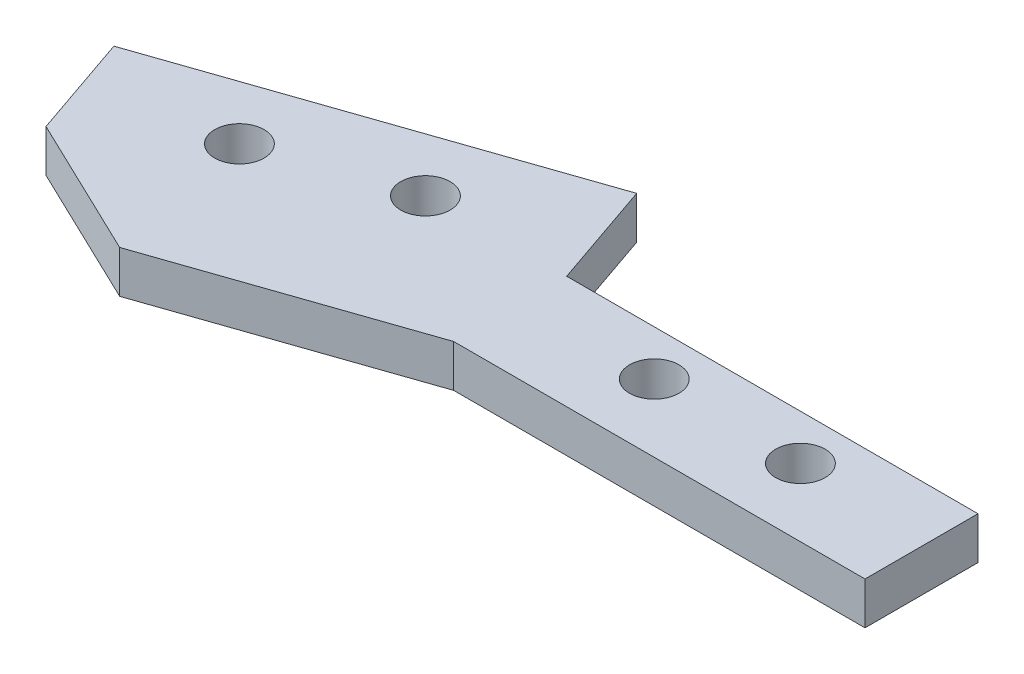
ISO-10303-21;
HEADER;
FILE_DESCRIPTION(('STEP AP214'),'2;1');
FILE_NAME('part.step','',(''),(''),'','','');
FILE_SCHEMA(('AUTOMOTIVE_DESIGN { 1 0 10303 214 1 1 1 1 }'));
ENDSEC;
DATA;
#1=APPLICATION_CONTEXT('core data for automotive mechanical design processes');
#2=APPLICATION_PROTOCOL_DEFINITION('international standard','automotive_design',2000,#1);
#3=PRODUCT_CONTEXT('',#1,'mechanical');
#4=PRODUCT('Part','Part','',(#3));
#5=PRODUCT_RELATED_PRODUCT_CATEGORY('part','',(#4));
#6=PRODUCT_DEFINITION_FORMATION('','',#4);
#7=PRODUCT_DEFINITION_CONTEXT('part definition',#1,'design');
#8=PRODUCT_DEFINITION('design','',#6,#7);
#9=PRODUCT_DEFINITION_SHAPE('','',#8);
#10=(LENGTH_UNIT() NAMED_UNIT(*) SI_UNIT(.MILLI.,.METRE.));
#11=(NAMED_UNIT(*) PLANE_ANGLE_UNIT() SI_UNIT($,.RADIAN.));
#12=(NAMED_UNIT(*) SI_UNIT($,.STERADIAN.) SOLID_ANGLE_UNIT());
#13=UNCERTAINTY_MEASURE_WITH_UNIT(LENGTH_MEASURE(1.E-05),#10,'distance_accuracy_value','');
#14=(GEOMETRIC_REPRESENTATION_CONTEXT(3) GLOBAL_UNCERTAINTY_ASSIGNED_CONTEXT((#13)) GLOBAL_UNIT_ASSIGNED_CONTEXT((#10,
#11,#12)) REPRESENTATION_CONTEXT('',''));
#15=CARTESIAN_POINT('',(0.,0.,0.));
#16=DIRECTION('',(0.,0.,1.));
#17=DIRECTION('',(1.,0.,0.));
#18=AXIS2_PLACEMENT_3D('',#15,#16,#17);
#19=CARTESIAN_POINT('',(-11.6856515049961,3.,-33.9375962135392));
#20=DIRECTION('',(0.325568154457151,0.,0.945518575599319));
#21=DIRECTION('',(0.945518575599319,0.,-0.325568154457151));
#22=AXIS2_PLACEMENT_3D('',#19,#20,#21);
#23=PLANE('',#22);
#24=DIRECTION('',(0.,-1.,0.));
#25=VECTOR('',#24,1.);
#26=CARTESIAN_POINT('',(-67.822315900336,10.,-14.6081925442493));
#27=LINE('',#26,#25);
#28=CARTESIAN_POINT('',(-67.822315900336,3.,-14.6081925442493));
#29=VERTEX_POINT('',#28);
#30=CARTESIAN_POINT('',(-67.822315900336,0.,-14.6081925442493));
#31=VERTEX_POINT('',#30);
#32=EDGE_CURVE('E123',#29,#31,#27,.T.);
#33=ORIENTED_EDGE('',*,*,#32,.T.);
#34=DIRECTION('',(-0.945518575599319,0.,0.325568154457151));
#35=VECTOR('',#34,1.);
#36=CARTESIAN_POINT('',(-11.6856515049961,0.,-33.9375962135392));
#37=LINE('',#36,#35);
#38=CARTESIAN_POINT('',(-50.2257439693409,0.,-20.6671781593286));
#39=VERTEX_POINT('',#38);
#40=EDGE_CURVE('E122',#39,#31,#37,.T.);
#41=ORIENTED_EDGE('',*,*,#40,.F.);
#42=DIRECTION('',(0.,-1.,0.));
#43=VECTOR('',#42,1.);
#44=CARTESIAN_POINT('',(-50.2257439693409,3.,-20.6671781593286));
#45=LINE('',#44,#43);
#46=CARTESIAN_POINT('',(-50.2257439693409,3.,-20.6671781593286));
#47=VERTEX_POINT('',#46);
#48=EDGE_CURVE('E11',#47,#39,#45,.T.);
#49=ORIENTED_EDGE('',*,*,#48,.F.);
#50=DIRECTION('',(-0.945518575599319,0.,0.325568154457151));
#51=VECTOR('',#50,1.);
#52=CARTESIAN_POINT('',(-11.6856515049961,3.,-33.9375962135392));
#53=LINE('',#52,#51);
#54=EDGE_CURVE('E147',#47,#29,#53,.T.);
#55=ORIENTED_EDGE('',*,*,#54,.T.);
#56=EDGE_LOOP('',(#33,#41,#49,#55));
#57=FACE_BOUND('',#56,.T.);
#58=ADVANCED_FACE('F34',(#57),#23,.T.);
#59=CARTESIAN_POINT('',(0.,3.,0.));
#60=DIRECTION('',(0.,1.,0.));
#61=DIRECTION('',(0.,0.,1.));
#62=AXIS2_PLACEMENT_3D('',#59,#60,#61);
#63=PLANE('',#62);
#64=DIRECTION('',(-0.901649680844333,0.,-0.432467169890748));
#65=VECTOR('',#64,1.);
#66=CARTESIAN_POINT('',(-6.98843284864242,3.,14.5701655207083));
#67=LINE('',#66,#65);
#68=CARTESIAN_POINT('',(-77.8479852024577,3.,-19.4169036450938));
#69=VERTEX_POINT('',#68);
#70=EDGE_CURVE('E50',#29,#69,#67,.T.);
#71=ORIENTED_EDGE('',*,*,#70,.F.);
#72=ORIENTED_EDGE('',*,*,#54,.F.);
#73=DIRECTION('',(1.,0.,0.));
#74=VECTOR('',#73,1.);
#75=CARTESIAN_POINT('',(0.,3.,-20.6671781593286));
#76=LINE('',#75,#74);
#77=CARTESIAN_POINT('',(-21.0955516893409,3.,-20.6671781593286));
#78=VERTEX_POINT('',#77);
#79=EDGE_CURVE('E149',#47,#78,#76,.T.);
#80=ORIENTED_EDGE('',*,*,#79,.T.);
#81=DIRECTION('',(0.,0.,1.));
#82=VECTOR('',#81,1.);
#83=CARTESIAN_POINT('',(-21.0955516893409,3.,0.));
#84=LINE('',#83,#82);
#85=CARTESIAN_POINT('',(-21.0955516893409,3.,-28.6704432593286));
#86=VERTEX_POINT('',#85);
#87=EDGE_CURVE('E151',#86,#78,#84,.T.);
#88=ORIENTED_EDGE('',*,*,#87,.F.);
#89=DIRECTION('',(1.,0.,0.));
#90=VECTOR('',#89,1.);
#91=CARTESIAN_POINT('',(0.,3.,-28.6704432593286));
#92=LINE('',#91,#90);
#93=CARTESIAN_POINT('',(-50.2257439693409,3.,-28.6704432593286));
#94=VERTEX_POINT('',#93);
#95=EDGE_CURVE('E154',#94,#86,#92,.T.);
#96=ORIENTED_EDGE('',*,*,#95,.F.);
#97=DIRECTION('',(0.325568154457154,0.,0.945518575599318));
#98=VECTOR('',#97,1.);
#99=CARTESIAN_POINT('',(-52.8302892049981,3.,-36.2345918641231));
#100=LINE('',#99,#98);
#101=CARTESIAN_POINT('',(-52.8302892049981,3.,-36.2345918641231));
#102=VERTEX_POINT('',#101);
#103=EDGE_CURVE('E132',#102,#94,#100,.T.);
#104=ORIENTED_EDGE('',*,*,#103,.F.);
#105=DIRECTION('',(0.945518575599318,0.,-0.325568154457154));
#106=VECTOR('',#105,1.);
#107=CARTESIAN_POINT('',(-52.8302892049981,3.,-36.2345918641231));
#108=LINE('',#107,#106);
#109=CARTESIAN_POINT('',(-80.3732453122062,3.,-26.7507915247862));
#110=VERTEX_POINT('',#109);
#111=EDGE_CURVE('E187',#110,#102,#108,.T.);
#112=ORIENTED_EDGE('',*,*,#111,.F.);
#113=DIRECTION('',(0.325568154457154,0.,0.945518575599318));
#114=VECTOR('',#113,1.);
#115=CARTESIAN_POINT('',(-80.3732453122062,3.,-26.7507915247862));
#116=LINE('',#115,#114);
#117=EDGE_CURVE('E128',#110,#69,#116,.T.);
#118=ORIENTED_EDGE('',*,*,#117,.T.);
#119=EDGE_LOOP('',(#71,#72,#80,#88,#96,#104,#112,#118));
#120=FACE_BOUND('',#119,.T.);
#121=CARTESIAN_POINT('',(-60.1598159333281,3.,-28.6007019462031));
#122=DIRECTION('',(0.,1.,0.));
#123=DIRECTION('',(0.,0.,1.));
#124=AXIS2_PLACEMENT_3D('',#121,#122,#123);
#125=CIRCLE('',#124,1.75000000000001);
#126=CARTESIAN_POINT('',(-60.1598159333281,3.,-26.8507019462031));
#127=VERTEX_POINT('',#126);
#128=EDGE_CURVE('E199',#127,#127,#125,.T.);
#129=ORIENTED_EDGE('',*,*,#128,.F.);
#130=EDGE_LOOP('',(#129));
#131=FACE_BOUND('',#130,.T.);
#132=CARTESIAN_POINT('',(-69.9356556828962,3.,-25.2013700885784));
#133=DIRECTION('',(0.,1.,0.));
#134=DIRECTION('',(0.,0.,1.));
#135=AXIS2_PLACEMENT_3D('',#132,#133,#134);
#136=CIRCLE('',#135,1.74999999999998);
#137=CARTESIAN_POINT('',(-69.9356556828962,3.,-23.4513700885784));
#138=VERTEX_POINT('',#137);
#139=EDGE_CURVE('E193',#138,#138,#136,.T.);
#140=ORIENTED_EDGE('',*,*,#139,.F.);
#141=EDGE_LOOP('',(#140));
#142=FACE_BOUND('',#141,.T.);
#143=CARTESIAN_POINT('',(-40.8205516893409,3.,-25.4671781460562));
#144=DIRECTION('',(0.,-1.,0.));
#145=DIRECTION('',(0.,0.,-1.));
#146=AXIS2_PLACEMENT_3D('',#143,#144,#145);
#147=CIRCLE('',#146,1.75);
#148=CARTESIAN_POINT('',(-40.8205516893409,3.,-27.2171781460562));
#149=VERTEX_POINT('',#148);
#150=EDGE_CURVE('E136',#149,#149,#147,.T.);
#151=ORIENTED_EDGE('',*,*,#150,.T.);
#152=EDGE_LOOP('',(#151));
#153=FACE_BOUND('',#152,.T.);
#154=CARTESIAN_POINT('',(-30.4705516893409,3.,-25.4671781460562));
#155=DIRECTION('',(0.,-1.,0.));
#156=DIRECTION('',(0.,0.,-1.));
#157=AXIS2_PLACEMENT_3D('',#154,#155,#156);
#158=CIRCLE('',#157,1.75);
#159=CARTESIAN_POINT('',(-30.4705516893409,3.,-27.2171781460562));
#160=VERTEX_POINT('',#159);
#161=EDGE_CURVE('E142',#160,#160,#158,.T.);
#162=ORIENTED_EDGE('',*,*,#161,.T.);
#163=EDGE_LOOP('',(#162));
#164=FACE_BOUND('',#163,.T.);
#165=ADVANCED_FACE('F208',(#120,#131,#142,#153,#164),#63,.T.);
#166=CARTESIAN_POINT('',(0.,0.,0.));
#167=DIRECTION('',(0.,1.,0.));
#168=DIRECTION('',(0.,0.,1.));
#169=AXIS2_PLACEMENT_3D('',#166,#167,#168);
#170=PLANE('',#169);
#171=CARTESIAN_POINT('',(-30.4705516893409,0.,-25.4671781460562));
#172=DIRECTION('',(0.,-1.,0.));
#173=DIRECTION('',(0.,0.,-1.));
#174=AXIS2_PLACEMENT_3D('',#171,#172,#173);
#175=CIRCLE('',#174,1.75);
#176=CARTESIAN_POINT('',(-30.4705516893409,0.,-27.2171781460562));
#177=VERTEX_POINT('',#176);
#178=EDGE_CURVE('E139',#177,#177,#175,.T.);
#179=ORIENTED_EDGE('',*,*,#178,.F.);
#180=EDGE_LOOP('',(#179));
#181=FACE_BOUND('',#180,.T.);
#182=CARTESIAN_POINT('',(-40.8205516893409,0.,-25.4671781460562));
#183=DIRECTION('',(0.,-1.,0.));
#184=DIRECTION('',(0.,0.,-1.));
#185=AXIS2_PLACEMENT_3D('',#182,#183,#184);
#186=CIRCLE('',#185,1.75);
#187=CARTESIAN_POINT('',(-40.8205516893409,0.,-27.2171781460562));
#188=VERTEX_POINT('',#187);
#189=EDGE_CURVE('E130',#188,#188,#186,.T.);
#190=ORIENTED_EDGE('',*,*,#189,.F.);
#191=EDGE_LOOP('',(#190));
#192=FACE_BOUND('',#191,.T.);
#193=CARTESIAN_POINT('',(-69.9356556828962,0.,-25.2013700885784));
#194=DIRECTION('',(0.,-1.,0.));
#195=DIRECTION('',(0.,0.,-1.));
#196=AXIS2_PLACEMENT_3D('',#193,#194,#195);
#197=CIRCLE('',#196,1.74999999999998);
#198=CARTESIAN_POINT('',(-69.9356556828962,0.,-26.9513700885784));
#199=VERTEX_POINT('',#198);
#200=EDGE_CURVE('E196',#199,#199,#197,.T.);
#201=ORIENTED_EDGE('',*,*,#200,.F.);
#202=EDGE_LOOP('',(#201));
#203=FACE_BOUND('',#202,.T.);
#204=CARTESIAN_POINT('',(-60.1598159333281,0.,-28.6007019462031));
#205=DIRECTION('',(0.,-1.,0.));
#206=DIRECTION('',(0.,0.,-1.));
#207=AXIS2_PLACEMENT_3D('',#204,#205,#206);
#208=CIRCLE('',#207,1.75000000000001);
#209=CARTESIAN_POINT('',(-60.1598159333281,0.,-30.3507019462032));
#210=VERTEX_POINT('',#209);
#211=EDGE_CURVE('E113',#210,#210,#208,.T.);
#212=ORIENTED_EDGE('',*,*,#211,.F.);
#213=EDGE_LOOP('',(#212));
#214=FACE_BOUND('',#213,.T.);
#215=ORIENTED_EDGE('',*,*,#40,.T.);
#216=DIRECTION('',(0.901649680844333,0.,0.432467169890748));
#217=VECTOR('',#216,1.);
#218=CARTESIAN_POINT('',(-6.98843284864242,0.,14.5701655207083));
#219=LINE('',#218,#217);
#220=CARTESIAN_POINT('',(-77.8479852024577,0.,-19.4169036450938));
#221=VERTEX_POINT('',#220);
#222=EDGE_CURVE('E107',#221,#31,#219,.T.);
#223=ORIENTED_EDGE('',*,*,#222,.F.);
#224=DIRECTION('',(0.325568154457154,0.,0.945518575599318));
#225=VECTOR('',#224,1.);
#226=CARTESIAN_POINT('',(-80.3732453122062,0.,-26.7507915247862));
#227=LINE('',#226,#225);
#228=CARTESIAN_POINT('',(-80.3732453122062,0.,-26.7507915247862));
#229=VERTEX_POINT('',#228);
#230=EDGE_CURVE('E119',#229,#221,#227,.T.);
#231=ORIENTED_EDGE('',*,*,#230,.F.);
#232=DIRECTION('',(-0.945518575599318,0.,0.325568154457154));
#233=VECTOR('',#232,1.);
#234=CARTESIAN_POINT('',(-52.8302892049981,0.,-36.2345918641231));
#235=LINE('',#234,#233);
#236=CARTESIAN_POINT('',(-52.8302892049981,0.,-36.2345918641231));
#237=VERTEX_POINT('',#236);
#238=EDGE_CURVE('E177',#237,#229,#235,.T.);
#239=ORIENTED_EDGE('',*,*,#238,.F.);
#240=DIRECTION('',(0.325568154457154,0.,0.945518575599318));
#241=VECTOR('',#240,1.);
#242=CARTESIAN_POINT('',(-52.8302892049981,0.,-36.2345918641231));
#243=LINE('',#242,#241);
#244=CARTESIAN_POINT('',(-50.2257439693409,0.,-28.6704432593286));
#245=VERTEX_POINT('',#244);
#246=EDGE_CURVE('E127',#237,#245,#243,.T.);
#247=ORIENTED_EDGE('',*,*,#246,.T.);
#248=DIRECTION('',(1.,0.,0.));
#249=VECTOR('',#248,1.);
#250=CARTESIAN_POINT('',(0.,0.,-28.6704432593286));
#251=LINE('',#250,#249);
#252=CARTESIAN_POINT('',(-21.0955516893409,0.,-28.6704432593286));
#253=VERTEX_POINT('',#252);
#254=EDGE_CURVE('E77',#245,#253,#251,.T.);
#255=ORIENTED_EDGE('',*,*,#254,.T.);
#256=DIRECTION('',(0.,0.,1.));
#257=VECTOR('',#256,1.);
#258=CARTESIAN_POINT('',(-21.0955516893409,0.,0.));
#259=LINE('',#258,#257);
#260=CARTESIAN_POINT('',(-21.0955516893409,0.,-20.6671781593286));
#261=VERTEX_POINT('',#260);
#262=EDGE_CURVE('E160',#253,#261,#259,.T.);
#263=ORIENTED_EDGE('',*,*,#262,.T.);
#264=DIRECTION('',(1.,0.,0.));
#265=VECTOR('',#264,1.);
#266=CARTESIAN_POINT('',(0.,0.,-20.6671781593286));
#267=LINE('',#266,#265);
#268=EDGE_CURVE('E157',#39,#261,#267,.T.);
#269=ORIENTED_EDGE('',*,*,#268,.F.);
#270=EDGE_LOOP('',(#215,#223,#231,#239,#247,#255,#263,#269));
#271=FACE_BOUND('',#270,.T.);
#272=ADVANCED_FACE('F118',(#181,#192,#203,#214,#271),#170,.F.);
#273=CARTESIAN_POINT('',(-80.3732453122062,3.,-26.7507915247862));
#274=DIRECTION('',(0.945518575599318,0.,-0.325568154457154));
#275=DIRECTION('',(-0.325568154457154,0.,-0.945518575599318));
#276=AXIS2_PLACEMENT_3D('',#273,#274,#275);
#277=PLANE('',#276);
#278=DIRECTION('',(0.,-1.,0.));
#279=VECTOR('',#278,1.);
#280=CARTESIAN_POINT('',(-77.8479852024577,3.,-19.4169036450938));
#281=LINE('',#280,#279);
#282=EDGE_CURVE('E104',#69,#221,#281,.T.);
#283=ORIENTED_EDGE('',*,*,#282,.F.);
#284=ORIENTED_EDGE('',*,*,#117,.F.);
#285=DIRECTION('',(0.,1.,0.));
#286=VECTOR('',#285,1.);
#287=CARTESIAN_POINT('',(-80.3732453122062,3.,-26.7507915247862));
#288=LINE('',#287,#286);
#289=EDGE_CURVE('E126',#229,#110,#288,.T.);
#290=ORIENTED_EDGE('',*,*,#289,.F.);
#291=ORIENTED_EDGE('',*,*,#230,.T.);
#292=EDGE_LOOP('',(#283,#284,#290,#291));
#293=FACE_BOUND('',#292,.T.);
#294=ADVANCED_FACE('F125',(#293),#277,.F.);
#295=CARTESIAN_POINT('',(0.,3.,-20.6671781593286));
#296=DIRECTION('',(0.,0.,-1.));
#297=DIRECTION('',(-1.,0.,0.));
#298=AXIS2_PLACEMENT_3D('',#295,#296,#297);
#299=PLANE('',#298);
#300=ORIENTED_EDGE('',*,*,#268,.T.);
#301=DIRECTION('',(0.,-1.,0.));
#302=VECTOR('',#301,1.);
#303=CARTESIAN_POINT('',(-21.0955516893409,3.,-20.6671781593286));
#304=LINE('',#303,#302);
#305=EDGE_CURVE('E42',#78,#261,#304,.T.);
#306=ORIENTED_EDGE('',*,*,#305,.F.);
#307=ORIENTED_EDGE('',*,*,#79,.F.);
#308=ORIENTED_EDGE('',*,*,#48,.T.);
#309=EDGE_LOOP('',(#300,#306,#307,#308));
#310=FACE_BOUND('',#309,.T.);
#311=ADVANCED_FACE('F175',(#310),#299,.F.);
#312=CARTESIAN_POINT('',(-21.0955516893409,3.,0.));
#313=DIRECTION('',(1.,0.,0.));
#314=DIRECTION('',(0.,0.,-1.));
#315=AXIS2_PLACEMENT_3D('',#312,#313,#314);
#316=PLANE('',#315);
#317=ORIENTED_EDGE('',*,*,#262,.F.);
#318=DIRECTION('',(0.,-1.,0.));
#319=VECTOR('',#318,1.);
#320=CARTESIAN_POINT('',(-21.0955516893409,3.,-28.6704432593286));
#321=LINE('',#320,#319);
#322=EDGE_CURVE('E165',#86,#253,#321,.T.);
#323=ORIENTED_EDGE('',*,*,#322,.F.);
#324=ORIENTED_EDGE('',*,*,#87,.T.);
#325=ORIENTED_EDGE('',*,*,#305,.T.);
#326=EDGE_LOOP('',(#317,#323,#324,#325));
#327=FACE_BOUND('',#326,.T.);
#328=ADVANCED_FACE('F172',(#327),#316,.T.);
#329=CARTESIAN_POINT('',(0.,3.,-28.6704432593286));
#330=DIRECTION('',(0.,0.,-1.));
#331=DIRECTION('',(-1.,0.,0.));
#332=AXIS2_PLACEMENT_3D('',#329,#330,#331);
#333=PLANE('',#332);
#334=ORIENTED_EDGE('',*,*,#254,.F.);
#335=DIRECTION('',(0.,-1.,0.));
#336=VECTOR('',#335,1.);
#337=CARTESIAN_POINT('',(-50.2257439693409,3.,-28.6704432593286));
#338=LINE('',#337,#336);
#339=EDGE_CURVE('E59',#94,#245,#338,.T.);
#340=ORIENTED_EDGE('',*,*,#339,.F.);
#341=ORIENTED_EDGE('',*,*,#95,.T.);
#342=ORIENTED_EDGE('',*,*,#322,.T.);
#343=EDGE_LOOP('',(#334,#340,#341,#342));
#344=FACE_BOUND('',#343,.T.);
#345=ADVANCED_FACE('F210',(#344),#333,.T.);
#346=CARTESIAN_POINT('',(-30.4705516893409,3.,-25.4671781460562));
#347=DIRECTION('',(0.,-1.,0.));
#348=DIRECTION('',(0.,0.,-1.));
#349=AXIS2_PLACEMENT_3D('',#346,#347,#348);
#350=CYLINDRICAL_SURFACE('',#349,1.75);
#351=ORIENTED_EDGE('',*,*,#161,.F.);
#352=EDGE_LOOP('',(#351));
#353=FACE_BOUND('',#352,.T.);
#354=ORIENTED_EDGE('',*,*,#178,.T.);
#355=EDGE_LOOP('',(#354));
#356=FACE_BOUND('',#355,.T.);
#357=ADVANCED_FACE('F212',(#353,#356),#350,.F.);
#358=CARTESIAN_POINT('',(-40.8205516893409,3.,-25.4671781460562));
#359=DIRECTION('',(0.,-1.,0.));
#360=DIRECTION('',(0.,0.,-1.));
#361=AXIS2_PLACEMENT_3D('',#358,#359,#360);
#362=CYLINDRICAL_SURFACE('',#361,1.75);
#363=ORIENTED_EDGE('',*,*,#150,.F.);
#364=EDGE_LOOP('',(#363));
#365=FACE_BOUND('',#364,.T.);
#366=ORIENTED_EDGE('',*,*,#189,.T.);
#367=EDGE_LOOP('',(#366));
#368=FACE_BOUND('',#367,.T.);
#369=ADVANCED_FACE('F218',(#365,#368),#362,.F.);
#370=CARTESIAN_POINT('',(-52.8302892049981,3.,-36.2345918641231));
#371=DIRECTION('',(-0.945518575599318,0.,0.325568154457154));
#372=DIRECTION('',(0.325568154457154,0.,0.945518575599318));
#373=AXIS2_PLACEMENT_3D('',#370,#371,#372);
#374=PLANE('',#373);
#375=ORIENTED_EDGE('',*,*,#339,.T.);
#376=ORIENTED_EDGE('',*,*,#246,.F.);
#377=DIRECTION('',(0.,-1.,0.));
#378=VECTOR('',#377,1.);
#379=CARTESIAN_POINT('',(-52.8302892049981,3.,-36.2345918641231));
#380=LINE('',#379,#378);
#381=EDGE_CURVE('E184',#102,#237,#380,.T.);
#382=ORIENTED_EDGE('',*,*,#381,.F.);
#383=ORIENTED_EDGE('',*,*,#103,.T.);
#384=EDGE_LOOP('',(#375,#376,#382,#383));
#385=FACE_BOUND('',#384,.T.);
#386=ADVANCED_FACE('F182',(#385),#374,.F.);
#387=CARTESIAN_POINT('',(-16.7538477400977,0.,-48.6567068497165));
#388=DIRECTION('',(-0.325568154457154,0.,-0.945518575599318));
#389=DIRECTION('',(-0.945518575599318,0.,0.325568154457154));
#390=AXIS2_PLACEMENT_3D('',#387,#388,#389);
#391=PLANE('',#390);
#392=ORIENTED_EDGE('',*,*,#381,.T.);
#393=ORIENTED_EDGE('',*,*,#238,.T.);
#394=ORIENTED_EDGE('',*,*,#289,.T.);
#395=ORIENTED_EDGE('',*,*,#111,.T.);
#396=EDGE_LOOP('',(#392,#393,#394,#395));
#397=FACE_BOUND('',#396,.T.);
#398=ADVANCED_FACE('F238',(#397),#391,.T.);
#399=CARTESIAN_POINT('',(-69.9356556828962,7.,-25.2013700885784));
#400=DIRECTION('',(0.,-1.,0.));
#401=DIRECTION('',(0.,0.,-1.));
#402=AXIS2_PLACEMENT_3D('',#399,#400,#401);
#403=CYLINDRICAL_SURFACE('',#402,1.74999999999998);
#404=ORIENTED_EDGE('',*,*,#139,.T.);
#405=EDGE_LOOP('',(#404));
#406=FACE_BOUND('',#405,.T.);
#407=ORIENTED_EDGE('',*,*,#200,.T.);
#408=EDGE_LOOP('',(#407));
#409=FACE_BOUND('',#408,.T.);
#410=ADVANCED_FACE('F243',(#406,#409),#403,.F.);
#411=CARTESIAN_POINT('',(-60.1598159333281,7.,-28.6007019462031));
#412=DIRECTION('',(0.,-1.,0.));
#413=DIRECTION('',(0.,0.,-1.));
#414=AXIS2_PLACEMENT_3D('',#411,#412,#413);
#415=CYLINDRICAL_SURFACE('',#414,1.75000000000001);
#416=ORIENTED_EDGE('',*,*,#128,.T.);
#417=EDGE_LOOP('',(#416));
#418=FACE_BOUND('',#417,.T.);
#419=ORIENTED_EDGE('',*,*,#211,.T.);
#420=EDGE_LOOP('',(#419));
#421=FACE_BOUND('',#420,.T.);
#422=ADVANCED_FACE('F246',(#418,#421),#415,.F.);
#423=CARTESIAN_POINT('',(-6.98843284864242,10.,14.5701655207083));
#424=DIRECTION('',(0.432467169890748,0.,-0.901649680844333));
#425=DIRECTION('',(-0.901649680844333,0.,-0.432467169890748));
#426=AXIS2_PLACEMENT_3D('',#423,#424,#425);
#427=PLANE('',#426);
#428=ORIENTED_EDGE('',*,*,#70,.T.);
#429=ORIENTED_EDGE('',*,*,#282,.T.);
#430=ORIENTED_EDGE('',*,*,#222,.T.);
#431=ORIENTED_EDGE('',*,*,#32,.F.);
#432=EDGE_LOOP('',(#428,#429,#430,#431));
#433=FACE_BOUND('',#432,.T.);
#434=ADVANCED_FACE('F106',(#433),#427,.F.);
#435=CLOSED_SHELL('',(#58,#165,#272,#294,#311,#328,#345,#357,#369,#386,#398,#410,#422,#434));
#436=MANIFOLD_SOLID_BREP('B2',#435);
#437=ADVANCED_BREP_SHAPE_REPRESENTATION('',(#18,#436),#14);
#438=SHAPE_DEFINITION_REPRESENTATION(#9,#437);
ENDSEC;
END-ISO-10303-21;
